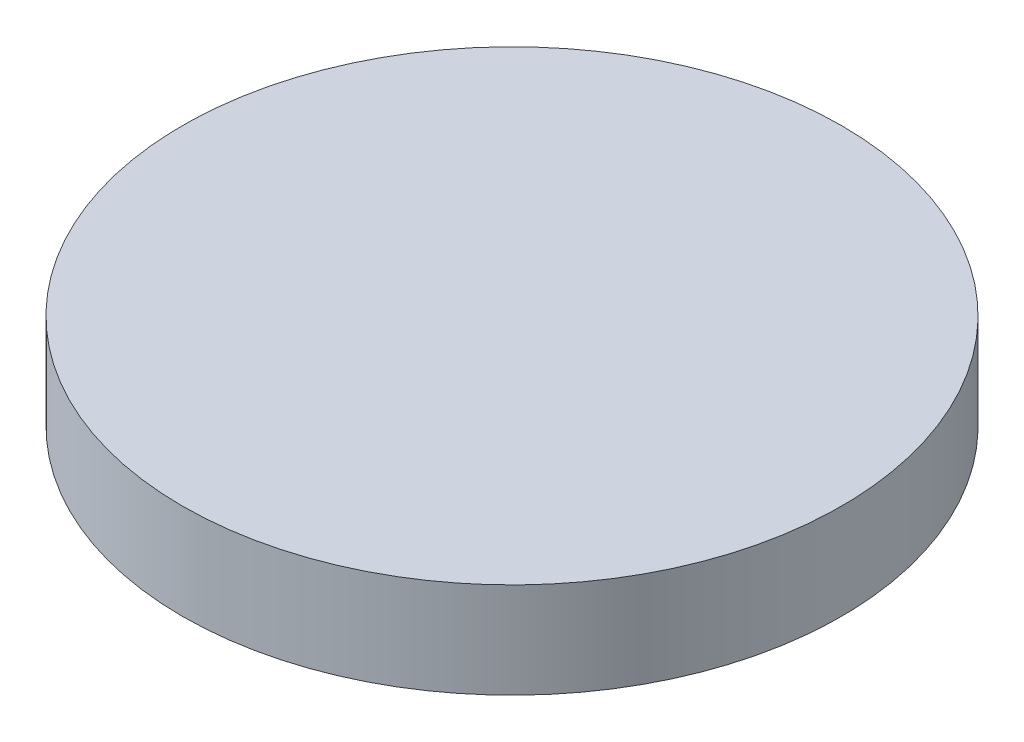
ISO-10303-21;
HEADER;
FILE_DESCRIPTION(('STEP AP214'),'2;1');
FILE_NAME('part.step','',(''),(''),'','','');
FILE_SCHEMA(('AUTOMOTIVE_DESIGN { 1 0 10303 214 1 1 1 1 }'));
ENDSEC;
DATA;
#1=APPLICATION_CONTEXT('core data for automotive mechanical design processes');
#2=APPLICATION_PROTOCOL_DEFINITION('international standard','automotive_design',2000,#1);
#3=PRODUCT_CONTEXT('',#1,'mechanical');
#4=PRODUCT('Part','Part','',(#3));
#5=PRODUCT_RELATED_PRODUCT_CATEGORY('part','',(#4));
#6=PRODUCT_DEFINITION_FORMATION('','',#4);
#7=PRODUCT_DEFINITION_CONTEXT('part definition',#1,'design');
#8=PRODUCT_DEFINITION('design','',#6,#7);
#9=PRODUCT_DEFINITION_SHAPE('','',#8);
#10=(LENGTH_UNIT() NAMED_UNIT(*) SI_UNIT(.MILLI.,.METRE.));
#11=(NAMED_UNIT(*) PLANE_ANGLE_UNIT() SI_UNIT($,.RADIAN.));
#12=(NAMED_UNIT(*) SI_UNIT($,.STERADIAN.) SOLID_ANGLE_UNIT());
#13=UNCERTAINTY_MEASURE_WITH_UNIT(LENGTH_MEASURE(1.E-05),#10,'distance_accuracy_value','');
#14=(GEOMETRIC_REPRESENTATION_CONTEXT(3) GLOBAL_UNCERTAINTY_ASSIGNED_CONTEXT((#13)) GLOBAL_UNIT_ASSIGNED_CONTEXT((#10,
#11,#12)) REPRESENTATION_CONTEXT('',''));
#15=CARTESIAN_POINT('',(0.,0.,0.));
#16=DIRECTION('',(0.,0.,1.));
#17=DIRECTION('',(1.,0.,0.));
#18=AXIS2_PLACEMENT_3D('',#15,#16,#17);
#19=CARTESIAN_POINT('',(0.,2.,0.));
#20=DIRECTION('',(0.,-1.,0.));
#21=DIRECTION('',(0.,0.,-1.));
#22=AXIS2_PLACEMENT_3D('',#19,#20,#21);
#23=CYLINDRICAL_SURFACE('',#22,6.9);
#24=CARTESIAN_POINT('',(0.,2.,0.));
#25=DIRECTION('',(0.,1.,0.));
#26=DIRECTION('',(0.,0.,1.));
#27=AXIS2_PLACEMENT_3D('',#24,#25,#26);
#28=CIRCLE('',#27,6.9);
#29=CARTESIAN_POINT('',(0.,2.,6.9));
#30=VERTEX_POINT('',#29);
#31=EDGE_CURVE('E10',#30,#30,#28,.T.);
#32=ORIENTED_EDGE('',*,*,#31,.F.);
#33=EDGE_LOOP('',(#32));
#34=FACE_BOUND('',#33,.T.);
#35=CARTESIAN_POINT('',(0.,0.,0.));
#36=DIRECTION('',(0.,1.,0.));
#37=DIRECTION('',(0.,0.,1.));
#38=AXIS2_PLACEMENT_3D('',#35,#36,#37);
#39=CIRCLE('',#38,6.9);
#40=CARTESIAN_POINT('',(0.,0.,6.9));
#41=VERTEX_POINT('',#40);
#42=EDGE_CURVE('E33',#41,#41,#39,.T.);
#43=ORIENTED_EDGE('',*,*,#42,.T.);
#44=EDGE_LOOP('',(#43));
#45=FACE_BOUND('',#44,.T.);
#46=ADVANCED_FACE('F30',(#34,#45),#23,.T.);
#47=CARTESIAN_POINT('',(0.,2.,0.));
#48=DIRECTION('',(0.,1.,0.));
#49=DIRECTION('',(0.,0.,1.));
#50=AXIS2_PLACEMENT_3D('',#47,#48,#49);
#51=PLANE('',#50);
#52=ORIENTED_EDGE('',*,*,#31,.T.);
#53=EDGE_LOOP('',(#52));
#54=FACE_BOUND('',#53,.T.);
#55=ADVANCED_FACE('F45',(#54),#51,.T.);
#56=CARTESIAN_POINT('',(0.,0.,0.));
#57=DIRECTION('',(0.,1.,0.));
#58=DIRECTION('',(0.,0.,1.));
#59=AXIS2_PLACEMENT_3D('',#56,#57,#58);
#60=PLANE('',#59);
#61=ORIENTED_EDGE('',*,*,#42,.F.);
#62=EDGE_LOOP('',(#61));
#63=FACE_BOUND('',#62,.T.);
#64=ADVANCED_FACE('F43',(#63),#60,.F.);
#65=CLOSED_SHELL('',(#46,#55,#64));
#66=MANIFOLD_SOLID_BREP('B2',#65);
#67=ADVANCED_BREP_SHAPE_REPRESENTATION('',(#18,#66),#14);
#68=SHAPE_DEFINITION_REPRESENTATION(#9,#67);
ENDSEC;
END-ISO-10303-21;
